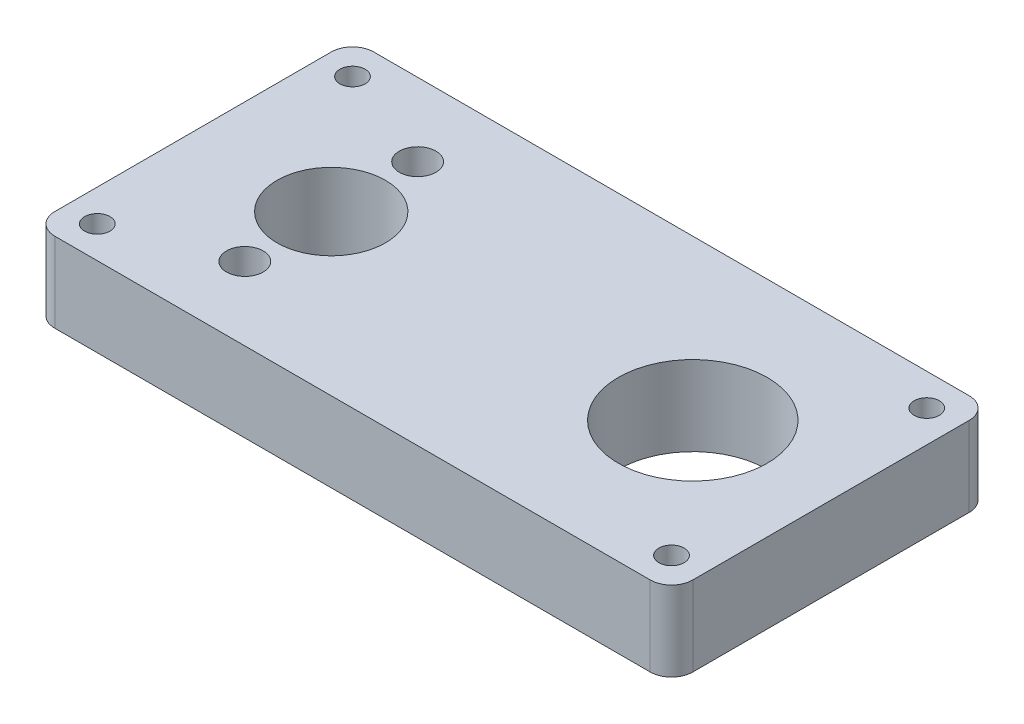
ISO-10303-21;
HEADER;
FILE_DESCRIPTION(('STEP AP214'),'2;1');
FILE_NAME('part.step','',(''),(''),'','','');
FILE_SCHEMA(('AUTOMOTIVE_DESIGN { 1 0 10303 214 1 1 1 1 }'));
ENDSEC;
DATA;
#1=APPLICATION_CONTEXT('core data for automotive mechanical design processes');
#2=APPLICATION_PROTOCOL_DEFINITION('international standard','automotive_design',2000,#1);
#3=PRODUCT_CONTEXT('',#1,'mechanical');
#4=PRODUCT('Part','Part','',(#3));
#5=PRODUCT_RELATED_PRODUCT_CATEGORY('part','',(#4));
#6=PRODUCT_DEFINITION_FORMATION('','',#4);
#7=PRODUCT_DEFINITION_CONTEXT('part definition',#1,'design');
#8=PRODUCT_DEFINITION('design','',#6,#7);
#9=PRODUCT_DEFINITION_SHAPE('','',#8);
#10=(LENGTH_UNIT() NAMED_UNIT(*) SI_UNIT(.MILLI.,.METRE.));
#11=(NAMED_UNIT(*) PLANE_ANGLE_UNIT() SI_UNIT($,.RADIAN.));
#12=(NAMED_UNIT(*) SI_UNIT($,.STERADIAN.) SOLID_ANGLE_UNIT());
#13=UNCERTAINTY_MEASURE_WITH_UNIT(LENGTH_MEASURE(1.E-05),#10,'distance_accuracy_value','');
#14=(GEOMETRIC_REPRESENTATION_CONTEXT(3) GLOBAL_UNCERTAINTY_ASSIGNED_CONTEXT((#13)) GLOBAL_UNIT_ASSIGNED_CONTEXT((#10,
#11,#12)) REPRESENTATION_CONTEXT('',''));
#15=CARTESIAN_POINT('',(0.,0.,0.));
#16=DIRECTION('',(0.,0.,1.));
#17=DIRECTION('',(1.,0.,0.));
#18=AXIS2_PLACEMENT_3D('',#15,#16,#17);
#19=CARTESIAN_POINT('',(-35.56,9.525,-16.51));
#20=DIRECTION('',(0.,-1.,0.));
#21=DIRECTION('',(0.,0.,-1.));
#22=AXIS2_PLACEMENT_3D('',#19,#20,#21);
#23=CYLINDRICAL_SURFACE('',#22,2.54);
#24=CARTESIAN_POINT('',(-35.56,0.,-16.51));
#25=DIRECTION('',(0.,-1.,0.));
#26=DIRECTION('',(0.,0.,-1.));
#27=AXIS2_PLACEMENT_3D('',#24,#25,#26);
#28=CIRCLE('',#27,2.54);
#29=CARTESIAN_POINT('',(-38.1,0.,-16.51));
#30=VERTEX_POINT('',#29);
#31=CARTESIAN_POINT('',(-35.56,0.,-19.05));
#32=VERTEX_POINT('',#31);
#33=EDGE_CURVE('E135',#30,#32,#28,.T.);
#34=ORIENTED_EDGE('',*,*,#33,.F.);
#35=DIRECTION('',(0.,-1.,0.));
#36=VECTOR('',#35,1.);
#37=CARTESIAN_POINT('',(-38.1,9.525,-16.51));
#38=LINE('',#37,#36);
#39=CARTESIAN_POINT('',(-38.1,9.525,-16.51));
#40=VERTEX_POINT('',#39);
#41=EDGE_CURVE('E11',#40,#30,#38,.T.);
#42=ORIENTED_EDGE('',*,*,#41,.F.);
#43=CARTESIAN_POINT('',(-35.56,9.525,-16.51));
#44=DIRECTION('',(0.,-1.,0.));
#45=DIRECTION('',(0.,0.,-1.));
#46=AXIS2_PLACEMENT_3D('',#43,#44,#45);
#47=CIRCLE('',#46,2.54);
#48=CARTESIAN_POINT('',(-35.56,9.525,-19.05));
#49=VERTEX_POINT('',#48);
#50=EDGE_CURVE('E156',#40,#49,#47,.T.);
#51=ORIENTED_EDGE('',*,*,#50,.T.);
#52=DIRECTION('',(0.,-1.,0.));
#53=VECTOR('',#52,1.);
#54=CARTESIAN_POINT('',(-35.56,9.525,-19.05));
#55=LINE('',#54,#53);
#56=EDGE_CURVE('E41',#49,#32,#55,.T.);
#57=ORIENTED_EDGE('',*,*,#56,.T.);
#58=EDGE_LOOP('',(#34,#42,#51,#57));
#59=FACE_BOUND('',#58,.T.);
#60=ADVANCED_FACE('F38',(#59),#23,.T.);
#61=CARTESIAN_POINT('',(-38.1,9.525,16.51));
#62=DIRECTION('',(-1.,0.,0.));
#63=DIRECTION('',(0.,0.,1.));
#64=AXIS2_PLACEMENT_3D('',#61,#62,#63);
#65=PLANE('',#64);
#66=DIRECTION('',(0.,0.,-1.));
#67=VECTOR('',#66,1.);
#68=CARTESIAN_POINT('',(-38.1,0.,16.51));
#69=LINE('',#68,#67);
#70=CARTESIAN_POINT('',(-38.1,0.,16.51));
#71=VERTEX_POINT('',#70);
#72=EDGE_CURVE('E154',#71,#30,#69,.T.);
#73=ORIENTED_EDGE('',*,*,#72,.F.);
#74=DIRECTION('',(0.,-1.,0.));
#75=VECTOR('',#74,1.);
#76=CARTESIAN_POINT('',(-38.1,9.525,16.51));
#77=LINE('',#76,#75);
#78=CARTESIAN_POINT('',(-38.1,9.525,16.51));
#79=VERTEX_POINT('',#78);
#80=EDGE_CURVE('E47',#79,#71,#77,.T.);
#81=ORIENTED_EDGE('',*,*,#80,.F.);
#82=DIRECTION('',(0.,0.,-1.));
#83=VECTOR('',#82,1.);
#84=CARTESIAN_POINT('',(-38.1,9.525,16.51));
#85=LINE('',#84,#83);
#86=EDGE_CURVE('E125',#79,#40,#85,.T.);
#87=ORIENTED_EDGE('',*,*,#86,.T.);
#88=ORIENTED_EDGE('',*,*,#41,.T.);
#89=EDGE_LOOP('',(#73,#81,#87,#88));
#90=FACE_BOUND('',#89,.T.);
#91=ADVANCED_FACE('F168',(#90),#65,.T.);
#92=CARTESIAN_POINT('',(-35.56,9.525,16.51));
#93=DIRECTION('',(0.,-1.,0.));
#94=DIRECTION('',(0.,0.,-1.));
#95=AXIS2_PLACEMENT_3D('',#92,#93,#94);
#96=CYLINDRICAL_SURFACE('',#95,2.54);
#97=CARTESIAN_POINT('',(-35.56,0.,16.51));
#98=DIRECTION('',(0.,-1.,0.));
#99=DIRECTION('',(0.,0.,-1.));
#100=AXIS2_PLACEMENT_3D('',#97,#98,#99);
#101=CIRCLE('',#100,2.54);
#102=CARTESIAN_POINT('',(-35.56,0.,19.05));
#103=VERTEX_POINT('',#102);
#104=EDGE_CURVE('E112',#103,#71,#101,.T.);
#105=ORIENTED_EDGE('',*,*,#104,.F.);
#106=DIRECTION('',(0.,-1.,0.));
#107=VECTOR('',#106,1.);
#108=CARTESIAN_POINT('',(-35.56,9.525,19.05));
#109=LINE('',#108,#107);
#110=CARTESIAN_POINT('',(-35.56,9.525,19.05));
#111=VERTEX_POINT('',#110);
#112=EDGE_CURVE('E107',#111,#103,#109,.T.);
#113=ORIENTED_EDGE('',*,*,#112,.F.);
#114=CARTESIAN_POINT('',(-35.56,9.525,16.51));
#115=DIRECTION('',(0.,-1.,0.));
#116=DIRECTION('',(0.,0.,-1.));
#117=AXIS2_PLACEMENT_3D('',#114,#115,#116);
#118=CIRCLE('',#117,2.54);
#119=EDGE_CURVE('E110',#111,#79,#118,.T.);
#120=ORIENTED_EDGE('',*,*,#119,.T.);
#121=ORIENTED_EDGE('',*,*,#80,.T.);
#122=EDGE_LOOP('',(#105,#113,#120,#121));
#123=FACE_BOUND('',#122,.T.);
#124=ADVANCED_FACE('F109',(#123),#96,.T.);
#125=CARTESIAN_POINT('',(35.56,9.525,19.05));
#126=DIRECTION('',(0.,0.,1.));
#127=DIRECTION('',(1.,0.,0.));
#128=AXIS2_PLACEMENT_3D('',#125,#126,#127);
#129=PLANE('',#128);
#130=DIRECTION('',(-1.,0.,0.));
#131=VECTOR('',#130,1.);
#132=CARTESIAN_POINT('',(35.56,0.,19.05));
#133=LINE('',#132,#131);
#134=CARTESIAN_POINT('',(35.56,0.,19.05));
#135=VERTEX_POINT('',#134);
#136=EDGE_CURVE('E151',#135,#103,#133,.T.);
#137=ORIENTED_EDGE('',*,*,#136,.F.);
#138=DIRECTION('',(0.,-1.,0.));
#139=VECTOR('',#138,1.);
#140=CARTESIAN_POINT('',(35.56,9.525,19.05));
#141=LINE('',#140,#139);
#142=CARTESIAN_POINT('',(35.56,9.525,19.05));
#143=VERTEX_POINT('',#142);
#144=EDGE_CURVE('E117',#143,#135,#141,.T.);
#145=ORIENTED_EDGE('',*,*,#144,.F.);
#146=DIRECTION('',(-1.,0.,0.));
#147=VECTOR('',#146,1.);
#148=CARTESIAN_POINT('',(35.56,9.525,19.05));
#149=LINE('',#148,#147);
#150=EDGE_CURVE('E123',#143,#111,#149,.T.);
#151=ORIENTED_EDGE('',*,*,#150,.T.);
#152=ORIENTED_EDGE('',*,*,#112,.T.);
#153=EDGE_LOOP('',(#137,#145,#151,#152));
#154=FACE_BOUND('',#153,.T.);
#155=ADVANCED_FACE('F127',(#154),#129,.T.);
#156=CARTESIAN_POINT('',(35.56,9.525,16.51));
#157=DIRECTION('',(0.,-1.,0.));
#158=DIRECTION('',(0.,0.,-1.));
#159=AXIS2_PLACEMENT_3D('',#156,#157,#158);
#160=CYLINDRICAL_SURFACE('',#159,2.54);
#161=CARTESIAN_POINT('',(35.56,0.,16.51));
#162=DIRECTION('',(0.,-1.,0.));
#163=DIRECTION('',(0.,0.,-1.));
#164=AXIS2_PLACEMENT_3D('',#161,#162,#163);
#165=CIRCLE('',#164,2.54);
#166=CARTESIAN_POINT('',(38.1,0.,16.51));
#167=VERTEX_POINT('',#166);
#168=EDGE_CURVE('E148',#167,#135,#165,.T.);
#169=ORIENTED_EDGE('',*,*,#168,.F.);
#170=DIRECTION('',(0.,-1.,0.));
#171=VECTOR('',#170,1.);
#172=CARTESIAN_POINT('',(38.1,9.525,16.51));
#173=LINE('',#172,#171);
#174=CARTESIAN_POINT('',(38.1,9.525,16.51));
#175=VERTEX_POINT('',#174);
#176=EDGE_CURVE('E160',#175,#167,#173,.T.);
#177=ORIENTED_EDGE('',*,*,#176,.F.);
#178=CARTESIAN_POINT('',(35.56,9.525,16.51));
#179=DIRECTION('',(0.,-1.,0.));
#180=DIRECTION('',(0.,0.,-1.));
#181=AXIS2_PLACEMENT_3D('',#178,#179,#180);
#182=CIRCLE('',#181,2.54);
#183=EDGE_CURVE('E128',#175,#143,#182,.T.);
#184=ORIENTED_EDGE('',*,*,#183,.T.);
#185=ORIENTED_EDGE('',*,*,#144,.T.);
#186=EDGE_LOOP('',(#169,#177,#184,#185));
#187=FACE_BOUND('',#186,.T.);
#188=ADVANCED_FACE('F181',(#187),#160,.T.);
#189=CARTESIAN_POINT('',(38.1,9.525,-16.51));
#190=DIRECTION('',(1.,0.,0.));
#191=DIRECTION('',(0.,0.,-1.));
#192=AXIS2_PLACEMENT_3D('',#189,#190,#191);
#193=PLANE('',#192);
#194=DIRECTION('',(0.,0.,1.));
#195=VECTOR('',#194,1.);
#196=CARTESIAN_POINT('',(38.1,0.,-16.51));
#197=LINE('',#196,#195);
#198=CARTESIAN_POINT('',(38.1,0.,-16.51));
#199=VERTEX_POINT('',#198);
#200=EDGE_CURVE('E145',#199,#167,#197,.T.);
#201=ORIENTED_EDGE('',*,*,#200,.F.);
#202=DIRECTION('',(0.,-1.,0.));
#203=VECTOR('',#202,1.);
#204=CARTESIAN_POINT('',(38.1,9.525,-16.51));
#205=LINE('',#204,#203);
#206=CARTESIAN_POINT('',(38.1,9.525,-16.51));
#207=VERTEX_POINT('',#206);
#208=EDGE_CURVE('E162',#207,#199,#205,.T.);
#209=ORIENTED_EDGE('',*,*,#208,.F.);
#210=DIRECTION('',(0.,0.,1.));
#211=VECTOR('',#210,1.);
#212=CARTESIAN_POINT('',(38.1,9.525,-16.51));
#213=LINE('',#212,#211);
#214=EDGE_CURVE('E130',#207,#175,#213,.T.);
#215=ORIENTED_EDGE('',*,*,#214,.T.);
#216=ORIENTED_EDGE('',*,*,#176,.T.);
#217=EDGE_LOOP('',(#201,#209,#215,#216));
#218=FACE_BOUND('',#217,.T.);
#219=ADVANCED_FACE('F184',(#218),#193,.T.);
#220=CARTESIAN_POINT('',(35.56,9.525,-16.51));
#221=DIRECTION('',(0.,-1.,0.));
#222=DIRECTION('',(0.,0.,-1.));
#223=AXIS2_PLACEMENT_3D('',#220,#221,#222);
#224=CYLINDRICAL_SURFACE('',#223,2.54);
#225=CARTESIAN_POINT('',(35.56,0.,-16.51));
#226=DIRECTION('',(0.,-1.,0.));
#227=DIRECTION('',(0.,0.,-1.));
#228=AXIS2_PLACEMENT_3D('',#225,#226,#227);
#229=CIRCLE('',#228,2.54);
#230=CARTESIAN_POINT('',(35.56,0.,-19.05));
#231=VERTEX_POINT('',#230);
#232=EDGE_CURVE('E142',#231,#199,#229,.T.);
#233=ORIENTED_EDGE('',*,*,#232,.F.);
#234=DIRECTION('',(0.,-1.,0.));
#235=VECTOR('',#234,1.);
#236=CARTESIAN_POINT('',(35.56,9.525,-19.05));
#237=LINE('',#236,#235);
#238=CARTESIAN_POINT('',(35.56,9.525,-19.05));
#239=VERTEX_POINT('',#238);
#240=EDGE_CURVE('E163',#239,#231,#237,.T.);
#241=ORIENTED_EDGE('',*,*,#240,.F.);
#242=CARTESIAN_POINT('',(35.56,9.525,-16.51));
#243=DIRECTION('',(0.,-1.,0.));
#244=DIRECTION('',(0.,0.,-1.));
#245=AXIS2_PLACEMENT_3D('',#242,#243,#244);
#246=CIRCLE('',#245,2.54);
#247=EDGE_CURVE('E290',#239,#207,#246,.T.);
#248=ORIENTED_EDGE('',*,*,#247,.T.);
#249=ORIENTED_EDGE('',*,*,#208,.T.);
#250=EDGE_LOOP('',(#233,#241,#248,#249));
#251=FACE_BOUND('',#250,.T.);
#252=ADVANCED_FACE('F188',(#251),#224,.T.);
#253=CARTESIAN_POINT('',(-35.56,9.525,-19.05));
#254=DIRECTION('',(0.,0.,-1.));
#255=DIRECTION('',(-1.,0.,0.));
#256=AXIS2_PLACEMENT_3D('',#253,#254,#255);
#257=PLANE('',#256);
#258=DIRECTION('',(1.,0.,0.));
#259=VECTOR('',#258,1.);
#260=CARTESIAN_POINT('',(-35.56,0.,-19.05));
#261=LINE('',#260,#259);
#262=EDGE_CURVE('E138',#32,#231,#261,.T.);
#263=ORIENTED_EDGE('',*,*,#262,.F.);
#264=ORIENTED_EDGE('',*,*,#56,.F.);
#265=DIRECTION('',(1.,0.,0.));
#266=VECTOR('',#265,1.);
#267=CARTESIAN_POINT('',(-35.56,9.525,-19.05));
#268=LINE('',#267,#266);
#269=EDGE_CURVE('E288',#49,#239,#268,.T.);
#270=ORIENTED_EDGE('',*,*,#269,.T.);
#271=ORIENTED_EDGE('',*,*,#240,.T.);
#272=EDGE_LOOP('',(#263,#264,#270,#271));
#273=FACE_BOUND('',#272,.T.);
#274=ADVANCED_FACE('F165',(#273),#257,.T.);
#275=CARTESIAN_POINT('',(-35.56,9.525,-16.51));
#276=DIRECTION('',(0.,-1.,0.));
#277=DIRECTION('',(0.,0.,-1.));
#278=AXIS2_PLACEMENT_3D('',#275,#276,#277);
#279=PLANE('',#278);
#280=CARTESIAN_POINT('',(-34.29,9.525,-15.24));
#281=DIRECTION('',(0.,1.,0.));
#282=DIRECTION('',(0.,0.,1.));
#283=AXIS2_PLACEMENT_3D('',#280,#281,#282);
#284=CIRCLE('',#283,1.5113);
#285=CARTESIAN_POINT('',(-34.29,9.525,-13.7287));
#286=VERTEX_POINT('',#285);
#287=EDGE_CURVE('E242',#286,#286,#284,.T.);
#288=ORIENTED_EDGE('',*,*,#287,.F.);
#289=EDGE_LOOP('',(#288));
#290=FACE_BOUND('',#289,.T.);
#291=CARTESIAN_POINT('',(-34.29,9.525,15.24));
#292=DIRECTION('',(0.,1.,0.));
#293=DIRECTION('',(0.,0.,1.));
#294=AXIS2_PLACEMENT_3D('',#291,#292,#293);
#295=CIRCLE('',#294,1.5113);
#296=CARTESIAN_POINT('',(-34.29,9.525,16.7513));
#297=VERTEX_POINT('',#296);
#298=EDGE_CURVE('E244',#297,#297,#295,.T.);
#299=ORIENTED_EDGE('',*,*,#298,.F.);
#300=EDGE_LOOP('',(#299));
#301=FACE_BOUND('',#300,.T.);
#302=CARTESIAN_POINT('',(34.29,9.525,15.24));
#303=DIRECTION('',(0.,1.,0.));
#304=DIRECTION('',(0.,0.,1.));
#305=AXIS2_PLACEMENT_3D('',#302,#303,#304);
#306=CIRCLE('',#305,1.5113);
#307=CARTESIAN_POINT('',(34.29,9.525,16.7513));
#308=VERTEX_POINT('',#307);
#309=EDGE_CURVE('E252',#308,#308,#306,.T.);
#310=ORIENTED_EDGE('',*,*,#309,.F.);
#311=EDGE_LOOP('',(#310));
#312=FACE_BOUND('',#311,.T.);
#313=CARTESIAN_POINT('',(34.29,9.525,-15.24));
#314=DIRECTION('',(0.,1.,0.));
#315=DIRECTION('',(0.,0.,1.));
#316=AXIS2_PLACEMENT_3D('',#313,#314,#315);
#317=CIRCLE('',#316,1.5113);
#318=CARTESIAN_POINT('',(34.29,9.525,-13.7287));
#319=VERTEX_POINT('',#318);
#320=EDGE_CURVE('E258',#319,#319,#317,.T.);
#321=ORIENTED_EDGE('',*,*,#320,.F.);
#322=EDGE_LOOP('',(#321));
#323=FACE_BOUND('',#322,.T.);
#324=CARTESIAN_POINT('',(21.59,9.525,0.));
#325=DIRECTION('',(0.,-1.,0.));
#326=DIRECTION('',(0.,0.,1.));
#327=AXIS2_PLACEMENT_3D('',#324,#325,#326);
#328=CIRCLE('',#327,8.89);
#329=CARTESIAN_POINT('',(21.59,9.525,-8.89));
#330=VERTEX_POINT('',#329);
#331=EDGE_CURVE('E265',#330,#330,#328,.T.);
#332=ORIENTED_EDGE('',*,*,#331,.T.);
#333=EDGE_LOOP('',(#332));
#334=FACE_BOUND('',#333,.T.);
#335=CARTESIAN_POINT('',(-21.59,9.525,10.31875));
#336=DIRECTION('',(0.,-1.,0.));
#337=DIRECTION('',(0.,0.,-1.));
#338=AXIS2_PLACEMENT_3D('',#335,#336,#337);
#339=CIRCLE('',#338,2.19075000000001);
#340=CARTESIAN_POINT('',(-21.59,9.525,8.12799999999999));
#341=VERTEX_POINT('',#340);
#342=EDGE_CURVE('E271',#341,#341,#339,.T.);
#343=ORIENTED_EDGE('',*,*,#342,.T.);
#344=EDGE_LOOP('',(#343));
#345=FACE_BOUND('',#344,.T.);
#346=CARTESIAN_POINT('',(-21.59,9.525,-10.31875));
#347=DIRECTION('',(0.,-1.,0.));
#348=DIRECTION('',(0.,0.,-1.));
#349=AXIS2_PLACEMENT_3D('',#346,#347,#348);
#350=CIRCLE('',#349,2.19075000000001);
#351=CARTESIAN_POINT('',(-21.59,9.525,-12.5095));
#352=VERTEX_POINT('',#351);
#353=EDGE_CURVE('E277',#352,#352,#350,.T.);
#354=ORIENTED_EDGE('',*,*,#353,.T.);
#355=EDGE_LOOP('',(#354));
#356=FACE_BOUND('',#355,.T.);
#357=CARTESIAN_POINT('',(-21.59,9.525,0.));
#358=DIRECTION('',(0.,-1.,0.));
#359=DIRECTION('',(0.,0.,-1.));
#360=AXIS2_PLACEMENT_3D('',#357,#358,#359);
#361=CIRCLE('',#360,6.477);
#362=CARTESIAN_POINT('',(-21.59,9.525,-6.477));
#363=VERTEX_POINT('',#362);
#364=EDGE_CURVE('E139',#363,#363,#361,.T.);
#365=ORIENTED_EDGE('',*,*,#364,.T.);
#366=EDGE_LOOP('',(#365));
#367=FACE_BOUND('',#366,.T.);
#368=ORIENTED_EDGE('',*,*,#50,.F.);
#369=ORIENTED_EDGE('',*,*,#86,.F.);
#370=ORIENTED_EDGE('',*,*,#119,.F.);
#371=ORIENTED_EDGE('',*,*,#150,.F.);
#372=ORIENTED_EDGE('',*,*,#183,.F.);
#373=ORIENTED_EDGE('',*,*,#214,.F.);
#374=ORIENTED_EDGE('',*,*,#247,.F.);
#375=ORIENTED_EDGE('',*,*,#269,.F.);
#376=EDGE_LOOP('',(#368,#369,#370,#371,#372,#373,#374,#375));
#377=FACE_BOUND('',#376,.T.);
#378=ADVANCED_FACE('F121',(#290,#301,#312,#323,#334,#345,#356,#367,#377),#279,.F.);
#379=CARTESIAN_POINT('',(-35.56,0.,-16.51));
#380=DIRECTION('',(0.,-1.,0.));
#381=DIRECTION('',(0.,0.,-1.));
#382=AXIS2_PLACEMENT_3D('',#379,#380,#381);
#383=PLANE('',#382);
#384=CARTESIAN_POINT('',(-34.29,0.,-15.24));
#385=DIRECTION('',(0.,-1.,0.));
#386=DIRECTION('',(0.,0.,-1.));
#387=AXIS2_PLACEMENT_3D('',#384,#385,#386);
#388=CIRCLE('',#387,1.5113);
#389=CARTESIAN_POINT('',(-34.29,0.,-16.7513));
#390=VERTEX_POINT('',#389);
#391=EDGE_CURVE('E240',#390,#390,#388,.T.);
#392=ORIENTED_EDGE('',*,*,#391,.F.);
#393=EDGE_LOOP('',(#392));
#394=FACE_BOUND('',#393,.T.);
#395=CARTESIAN_POINT('',(-34.29,0.,15.24));
#396=DIRECTION('',(0.,-1.,0.));
#397=DIRECTION('',(0.,0.,-1.));
#398=AXIS2_PLACEMENT_3D('',#395,#396,#397);
#399=CIRCLE('',#398,1.5113);
#400=CARTESIAN_POINT('',(-34.29,0.,13.7287));
#401=VERTEX_POINT('',#400);
#402=EDGE_CURVE('E249',#401,#401,#399,.T.);
#403=ORIENTED_EDGE('',*,*,#402,.F.);
#404=EDGE_LOOP('',(#403));
#405=FACE_BOUND('',#404,.T.);
#406=CARTESIAN_POINT('',(34.29,0.,15.24));
#407=DIRECTION('',(0.,-1.,0.));
#408=DIRECTION('',(0.,0.,-1.));
#409=AXIS2_PLACEMENT_3D('',#406,#407,#408);
#410=CIRCLE('',#409,1.5113);
#411=CARTESIAN_POINT('',(34.29,0.,13.7287));
#412=VERTEX_POINT('',#411);
#413=EDGE_CURVE('E255',#412,#412,#410,.T.);
#414=ORIENTED_EDGE('',*,*,#413,.F.);
#415=EDGE_LOOP('',(#414));
#416=FACE_BOUND('',#415,.T.);
#417=CARTESIAN_POINT('',(34.29,0.,-15.24));
#418=DIRECTION('',(0.,-1.,0.));
#419=DIRECTION('',(0.,0.,-1.));
#420=AXIS2_PLACEMENT_3D('',#417,#418,#419);
#421=CIRCLE('',#420,1.5113);
#422=CARTESIAN_POINT('',(34.29,0.,-16.7513));
#423=VERTEX_POINT('',#422);
#424=EDGE_CURVE('E261',#423,#423,#421,.T.);
#425=ORIENTED_EDGE('',*,*,#424,.F.);
#426=EDGE_LOOP('',(#425));
#427=FACE_BOUND('',#426,.T.);
#428=CARTESIAN_POINT('',(21.59,0.,0.));
#429=DIRECTION('',(0.,-1.,0.));
#430=DIRECTION('',(0.,0.,1.));
#431=AXIS2_PLACEMENT_3D('',#428,#429,#430);
#432=CIRCLE('',#431,8.89);
#433=CARTESIAN_POINT('',(21.59,0.,-8.89));
#434=VERTEX_POINT('',#433);
#435=EDGE_CURVE('E264',#434,#434,#432,.T.);
#436=ORIENTED_EDGE('',*,*,#435,.F.);
#437=EDGE_LOOP('',(#436));
#438=FACE_BOUND('',#437,.T.);
#439=CARTESIAN_POINT('',(-21.59,0.,10.31875));
#440=DIRECTION('',(0.,-1.,0.));
#441=DIRECTION('',(0.,0.,-1.));
#442=AXIS2_PLACEMENT_3D('',#439,#440,#441);
#443=CIRCLE('',#442,2.19075000000001);
#444=CARTESIAN_POINT('',(-21.59,0.,8.12799999999999));
#445=VERTEX_POINT('',#444);
#446=EDGE_CURVE('E268',#445,#445,#443,.T.);
#447=ORIENTED_EDGE('',*,*,#446,.F.);
#448=EDGE_LOOP('',(#447));
#449=FACE_BOUND('',#448,.T.);
#450=CARTESIAN_POINT('',(-21.59,0.,-10.31875));
#451=DIRECTION('',(0.,-1.,0.));
#452=DIRECTION('',(0.,0.,-1.));
#453=AXIS2_PLACEMENT_3D('',#450,#451,#452);
#454=CIRCLE('',#453,2.19075000000001);
#455=CARTESIAN_POINT('',(-21.59,0.,-12.5095));
#456=VERTEX_POINT('',#455);
#457=EDGE_CURVE('E274',#456,#456,#454,.T.);
#458=ORIENTED_EDGE('',*,*,#457,.F.);
#459=EDGE_LOOP('',(#458));
#460=FACE_BOUND('',#459,.T.);
#461=CARTESIAN_POINT('',(-21.59,0.,0.));
#462=DIRECTION('',(0.,-1.,0.));
#463=DIRECTION('',(0.,0.,-1.));
#464=AXIS2_PLACEMENT_3D('',#461,#462,#463);
#465=CIRCLE('',#464,6.477);
#466=CARTESIAN_POINT('',(-21.59,0.,-6.477));
#467=VERTEX_POINT('',#466);
#468=EDGE_CURVE('E280',#467,#467,#465,.T.);
#469=ORIENTED_EDGE('',*,*,#468,.F.);
#470=EDGE_LOOP('',(#469));
#471=FACE_BOUND('',#470,.T.);
#472=ORIENTED_EDGE('',*,*,#33,.T.);
#473=ORIENTED_EDGE('',*,*,#262,.T.);
#474=ORIENTED_EDGE('',*,*,#232,.T.);
#475=ORIENTED_EDGE('',*,*,#200,.T.);
#476=ORIENTED_EDGE('',*,*,#168,.T.);
#477=ORIENTED_EDGE('',*,*,#136,.T.);
#478=ORIENTED_EDGE('',*,*,#104,.T.);
#479=ORIENTED_EDGE('',*,*,#72,.T.);
#480=EDGE_LOOP('',(#472,#473,#474,#475,#476,#477,#478,#479));
#481=FACE_BOUND('',#480,.T.);
#482=ADVANCED_FACE('F167',(#394,#405,#416,#427,#438,#449,#460,#471,#481),#383,.T.);
#483=CARTESIAN_POINT('',(-21.59,9.525,0.));
#484=DIRECTION('',(0.,-1.,0.));
#485=DIRECTION('',(0.,0.,-1.));
#486=AXIS2_PLACEMENT_3D('',#483,#484,#485);
#487=CYLINDRICAL_SURFACE('',#486,6.477);
#488=CARTESIAN_POINT('',(-21.59,9.525,-6.477));
#489=CARTESIAN_POINT('',(-21.59,9.42578125,-6.477));
#490=CARTESIAN_POINT('',(-21.59,9.3265625,-6.477));
#491=CARTESIAN_POINT('',(-21.59,9.128125,-6.477));
#492=CARTESIAN_POINT('',(-21.59,9.02890625,-6.477));
#493=CARTESIAN_POINT('',(-21.59,8.83046875,-6.477));
#494=CARTESIAN_POINT('',(-21.59,8.73125,-6.477));
#495=CARTESIAN_POINT('',(-21.59,8.5328125,-6.477));
#496=CARTESIAN_POINT('',(-21.59,8.43359375,-6.477));
#497=CARTESIAN_POINT('',(-21.59,8.23515625,-6.477));
#498=CARTESIAN_POINT('',(-21.59,8.1359375,-6.477));
#499=CARTESIAN_POINT('',(-21.59,7.9375,-6.477));
#500=CARTESIAN_POINT('',(-21.59,7.83828125,-6.477));
#501=CARTESIAN_POINT('',(-21.59,7.63984375,-6.477));
#502=CARTESIAN_POINT('',(-21.59,7.540625,-6.477));
#503=CARTESIAN_POINT('',(-21.59,7.3421875,-6.477));
#504=CARTESIAN_POINT('',(-21.59,7.24296875,-6.477));
#505=CARTESIAN_POINT('',(-21.59,7.04453125,-6.477));
#506=CARTESIAN_POINT('',(-21.59,6.9453125,-6.477));
#507=CARTESIAN_POINT('',(-21.59,6.746875,-6.477));
#508=CARTESIAN_POINT('',(-21.59,6.64765625,-6.477));
#509=CARTESIAN_POINT('',(-21.59,6.44921875,-6.477));
#510=CARTESIAN_POINT('',(-21.59,6.35,-6.477));
#511=CARTESIAN_POINT('',(-21.59,6.1515625,-6.477));
#512=CARTESIAN_POINT('',(-21.59,6.05234375,-6.477));
#513=CARTESIAN_POINT('',(-21.59,5.85390625,-6.477));
#514=CARTESIAN_POINT('',(-21.59,5.7546875,-6.477));
#515=CARTESIAN_POINT('',(-21.59,5.55625,-6.477));
#516=CARTESIAN_POINT('',(-21.59,5.45703125,-6.477));
#517=CARTESIAN_POINT('',(-21.59,5.25859375,-6.477));
#518=CARTESIAN_POINT('',(-21.59,5.159375,-6.477));
#519=CARTESIAN_POINT('',(-21.59,4.9609375,-6.477));
#520=CARTESIAN_POINT('',(-21.59,4.86171875,-6.477));
#521=CARTESIAN_POINT('',(-21.59,4.66328125,-6.477));
#522=CARTESIAN_POINT('',(-21.59,4.5640625,-6.477));
#523=CARTESIAN_POINT('',(-21.59,4.365625,-6.477));
#524=CARTESIAN_POINT('',(-21.59,4.26640625,-6.477));
#525=CARTESIAN_POINT('',(-21.59,4.06796875,-6.477));
#526=CARTESIAN_POINT('',(-21.59,3.96875,-6.477));
#527=CARTESIAN_POINT('',(-21.59,3.7703125,-6.477));
#528=CARTESIAN_POINT('',(-21.59,3.67109375,-6.477));
#529=CARTESIAN_POINT('',(-21.59,3.47265625,-6.477));
#530=CARTESIAN_POINT('',(-21.59,3.3734375,-6.477));
#531=CARTESIAN_POINT('',(-21.59,3.175,-6.477));
#532=CARTESIAN_POINT('',(-21.59,3.07578125,-6.477));
#533=CARTESIAN_POINT('',(-21.59,2.87734375,-6.477));
#534=CARTESIAN_POINT('',(-21.59,2.778125,-6.477));
#535=CARTESIAN_POINT('',(-21.59,2.5796875,-6.477));
#536=CARTESIAN_POINT('',(-21.59,2.48046875,-6.477));
#537=CARTESIAN_POINT('',(-21.59,2.28203125,-6.477));
#538=CARTESIAN_POINT('',(-21.59,2.1828125,-6.477));
#539=CARTESIAN_POINT('',(-21.59,1.984375,-6.477));
#540=CARTESIAN_POINT('',(-21.59,1.88515625,-6.477));
#541=CARTESIAN_POINT('',(-21.59,1.68671875,-6.477));
#542=CARTESIAN_POINT('',(-21.59,1.5875,-6.477));
#543=CARTESIAN_POINT('',(-21.59,1.3890625,-6.477));
#544=CARTESIAN_POINT('',(-21.59,1.28984375,-6.477));
#545=CARTESIAN_POINT('',(-21.59,1.09140625,-6.477));
#546=CARTESIAN_POINT('',(-21.59,0.992187500000001,-6.477));
#547=CARTESIAN_POINT('',(-21.59,0.793750000000001,-6.477));
#548=CARTESIAN_POINT('',(-21.59,0.69453125,-6.477));
#549=CARTESIAN_POINT('',(-21.59,0.49609375,-6.477));
#550=CARTESIAN_POINT('',(-21.59,0.396875,-6.477));
#551=CARTESIAN_POINT('',(-21.59,0.1984375,-6.477));
#552=CARTESIAN_POINT('',(-21.59,0.0992187500000001,-6.477));
#553=CARTESIAN_POINT('',(-21.59,0.,-6.477));
#554=B_SPLINE_CURVE_WITH_KNOTS('',3,(#488,#489,#490,#491,#492,#493,#494,#495,#496,#497,#498,
#499,#500,#501,#502,#503,#504,#505,#506,#507,#508,#509,#510,#511,#512,#513,#514,#515,#516,#517,
#518,#519,#520,#521,#522,#523,#524,#525,#526,#527,#528,#529,#530,#531,#532,#533,#534,#535,#536,
#537,#538,#539,#540,#541,#542,#543,#544,#545,#546,#547,#548,#549,#550,#551,#552,#553),
.UNSPECIFIED.,.F.,.F.,(4,2,2,2,2,2,2,2,2,2,2,2,2,2,2,2,2,2,2,2,2,2,2,2,2,2,2,2,2,2,2,2,4),(0.,
0.297656249999998,0.595312499999999,0.892968749999999,1.190625,1.48828125,1.7859375,2.08359375,
2.38125,2.67890625,2.9765625,3.27421875,3.571875,3.86953125,4.1671875,4.46484375,4.7625,
5.06015625,5.3578125,5.65546875,5.953125,6.25078125,6.5484375,6.84609375,7.14375,7.44140625,
7.7390625,8.03671875,8.334375,8.63203125,8.9296875,9.22734375,9.525),.UNSPECIFIED.);
#555=EDGE_CURVE('BSEAM200',#363,#467,#554,.T.);
#556=ORIENTED_EDGE('',*,*,#364,.F.);
#557=ORIENTED_EDGE('',*,*,#468,.T.);
#558=ORIENTED_EDGE('',*,*,#555,.T.);
#559=ORIENTED_EDGE('',*,*,#555,.F.);
#560=EDGE_LOOP('',(#556,#558,#557,#559));
#561=FACE_BOUND('',#560,.T.);
#562=ADVANCED_FACE('F200',(#561),#487,.F.);
#563=CARTESIAN_POINT('',(-21.59,9.525,-10.31875));
#564=DIRECTION('',(0.,-1.,0.));
#565=DIRECTION('',(0.,0.,-1.));
#566=AXIS2_PLACEMENT_3D('',#563,#564,#565);
#567=CYLINDRICAL_SURFACE('',#566,2.19075000000001);
#568=CARTESIAN_POINT('',(-21.59,9.525,-12.5095));
#569=CARTESIAN_POINT('',(-21.59,9.42578125,-12.5095));
#570=CARTESIAN_POINT('',(-21.59,9.3265625,-12.5095));
#571=CARTESIAN_POINT('',(-21.59,9.128125,-12.5095));
#572=CARTESIAN_POINT('',(-21.59,9.02890625,-12.5095));
#573=CARTESIAN_POINT('',(-21.59,8.83046875,-12.5095));
#574=CARTESIAN_POINT('',(-21.59,8.73125,-12.5095));
#575=CARTESIAN_POINT('',(-21.59,8.5328125,-12.5095));
#576=CARTESIAN_POINT('',(-21.59,8.43359375,-12.5095));
#577=CARTESIAN_POINT('',(-21.59,8.23515625,-12.5095));
#578=CARTESIAN_POINT('',(-21.59,8.1359375,-12.5095));
#579=CARTESIAN_POINT('',(-21.59,7.9375,-12.5095));
#580=CARTESIAN_POINT('',(-21.59,7.83828125,-12.5095));
#581=CARTESIAN_POINT('',(-21.59,7.63984375,-12.5095));
#582=CARTESIAN_POINT('',(-21.59,7.540625,-12.5095));
#583=CARTESIAN_POINT('',(-21.59,7.3421875,-12.5095));
#584=CARTESIAN_POINT('',(-21.59,7.24296875,-12.5095));
#585=CARTESIAN_POINT('',(-21.59,7.04453125,-12.5095));
#586=CARTESIAN_POINT('',(-21.59,6.9453125,-12.5095));
#587=CARTESIAN_POINT('',(-21.59,6.746875,-12.5095));
#588=CARTESIAN_POINT('',(-21.59,6.64765625,-12.5095));
#589=CARTESIAN_POINT('',(-21.59,6.44921875,-12.5095));
#590=CARTESIAN_POINT('',(-21.59,6.35,-12.5095));
#591=CARTESIAN_POINT('',(-21.59,6.1515625,-12.5095));
#592=CARTESIAN_POINT('',(-21.59,6.05234375,-12.5095));
#593=CARTESIAN_POINT('',(-21.59,5.85390625,-12.5095));
#594=CARTESIAN_POINT('',(-21.59,5.7546875,-12.5095));
#595=CARTESIAN_POINT('',(-21.59,5.55625,-12.5095));
#596=CARTESIAN_POINT('',(-21.59,5.45703125,-12.5095));
#597=CARTESIAN_POINT('',(-21.59,5.25859375,-12.5095));
#598=CARTESIAN_POINT('',(-21.59,5.159375,-12.5095));
#599=CARTESIAN_POINT('',(-21.59,4.9609375,-12.5095));
#600=CARTESIAN_POINT('',(-21.59,4.86171875,-12.5095));
#601=CARTESIAN_POINT('',(-21.59,4.66328125,-12.5095));
#602=CARTESIAN_POINT('',(-21.59,4.5640625,-12.5095));
#603=CARTESIAN_POINT('',(-21.59,4.365625,-12.5095));
#604=CARTESIAN_POINT('',(-21.59,4.26640625,-12.5095));
#605=CARTESIAN_POINT('',(-21.59,4.06796875,-12.5095));
#606=CARTESIAN_POINT('',(-21.59,3.96875,-12.5095));
#607=CARTESIAN_POINT('',(-21.59,3.7703125,-12.5095));
#608=CARTESIAN_POINT('',(-21.59,3.67109375,-12.5095));
#609=CARTESIAN_POINT('',(-21.59,3.47265625,-12.5095));
#610=CARTESIAN_POINT('',(-21.59,3.3734375,-12.5095));
#611=CARTESIAN_POINT('',(-21.59,3.175,-12.5095));
#612=CARTESIAN_POINT('',(-21.59,3.07578125,-12.5095));
#613=CARTESIAN_POINT('',(-21.59,2.87734375,-12.5095));
#614=CARTESIAN_POINT('',(-21.59,2.778125,-12.5095));
#615=CARTESIAN_POINT('',(-21.59,2.5796875,-12.5095));
#616=CARTESIAN_POINT('',(-21.59,2.48046875,-12.5095));
#617=CARTESIAN_POINT('',(-21.59,2.28203125,-12.5095));
#618=CARTESIAN_POINT('',(-21.59,2.1828125,-12.5095));
#619=CARTESIAN_POINT('',(-21.59,1.984375,-12.5095));
#620=CARTESIAN_POINT('',(-21.59,1.88515625,-12.5095));
#621=CARTESIAN_POINT('',(-21.59,1.68671875,-12.5095));
#622=CARTESIAN_POINT('',(-21.59,1.5875,-12.5095));
#623=CARTESIAN_POINT('',(-21.59,1.3890625,-12.5095));
#624=CARTESIAN_POINT('',(-21.59,1.28984375,-12.5095));
#625=CARTESIAN_POINT('',(-21.59,1.09140625,-12.5095));
#626=CARTESIAN_POINT('',(-21.59,0.992187500000001,-12.5095));
#627=CARTESIAN_POINT('',(-21.59,0.793750000000001,-12.5095));
#628=CARTESIAN_POINT('',(-21.59,0.69453125,-12.5095));
#629=CARTESIAN_POINT('',(-21.59,0.49609375,-12.5095));
#630=CARTESIAN_POINT('',(-21.59,0.396875,-12.5095));
#631=CARTESIAN_POINT('',(-21.59,0.1984375,-12.5095));
#632=CARTESIAN_POINT('',(-21.59,0.0992187500000001,-12.5095));
#633=CARTESIAN_POINT('',(-21.59,0.,-12.5095));
#634=B_SPLINE_CURVE_WITH_KNOTS('',3,(#568,#569,#570,#571,#572,#573,#574,#575,#576,#577,#578,
#579,#580,#581,#582,#583,#584,#585,#586,#587,#588,#589,#590,#591,#592,#593,#594,#595,#596,#597,
#598,#599,#600,#601,#602,#603,#604,#605,#606,#607,#608,#609,#610,#611,#612,#613,#614,#615,#616,
#617,#618,#619,#620,#621,#622,#623,#624,#625,#626,#627,#628,#629,#630,#631,#632,#633),
.UNSPECIFIED.,.F.,.F.,(4,2,2,2,2,2,2,2,2,2,2,2,2,2,2,2,2,2,2,2,2,2,2,2,2,2,2,2,2,2,2,2,4),(0.,
0.297656249999998,0.595312499999999,0.892968749999999,1.190625,1.48828125,1.7859375,2.08359375,
2.38125,2.67890625,2.9765625,3.27421875,3.571875,3.86953125,4.1671875,4.46484375,4.7625,
5.06015625,5.3578125,5.65546875,5.953125,6.25078125,6.5484375,6.84609375,7.14375,7.44140625,
7.7390625,8.03671875,8.334375,8.63203125,8.9296875,9.22734375,9.525),.UNSPECIFIED.);
#635=EDGE_CURVE('BSEAM207',#352,#456,#634,.T.);
#636=ORIENTED_EDGE('',*,*,#353,.F.);
#637=ORIENTED_EDGE('',*,*,#457,.T.);
#638=ORIENTED_EDGE('',*,*,#635,.T.);
#639=ORIENTED_EDGE('',*,*,#635,.F.);
#640=EDGE_LOOP('',(#636,#638,#637,#639));
#641=FACE_BOUND('',#640,.T.);
#642=ADVANCED_FACE('F207',(#641),#567,.F.);
#643=CARTESIAN_POINT('',(-21.59,9.525,10.31875));
#644=DIRECTION('',(0.,-1.,0.));
#645=DIRECTION('',(0.,0.,-1.));
#646=AXIS2_PLACEMENT_3D('',#643,#644,#645);
#647=CYLINDRICAL_SURFACE('',#646,2.19075000000001);
#648=CARTESIAN_POINT('',(-21.59,9.525,8.12799999999999));
#649=CARTESIAN_POINT('',(-21.59,9.42578125,8.12799999999999));
#650=CARTESIAN_POINT('',(-21.59,9.3265625,8.12799999999999));
#651=CARTESIAN_POINT('',(-21.59,9.128125,8.12799999999999));
#652=CARTESIAN_POINT('',(-21.59,9.02890625,8.12799999999999));
#653=CARTESIAN_POINT('',(-21.59,8.83046875,8.12799999999999));
#654=CARTESIAN_POINT('',(-21.59,8.73125,8.12799999999999));
#655=CARTESIAN_POINT('',(-21.59,8.5328125,8.12799999999999));
#656=CARTESIAN_POINT('',(-21.59,8.43359375,8.12799999999999));
#657=CARTESIAN_POINT('',(-21.59,8.23515625,8.12799999999999));
#658=CARTESIAN_POINT('',(-21.59,8.1359375,8.12799999999999));
#659=CARTESIAN_POINT('',(-21.59,7.9375,8.12799999999999));
#660=CARTESIAN_POINT('',(-21.59,7.83828125,8.12799999999999));
#661=CARTESIAN_POINT('',(-21.59,7.63984375,8.12799999999999));
#662=CARTESIAN_POINT('',(-21.59,7.540625,8.12799999999999));
#663=CARTESIAN_POINT('',(-21.59,7.3421875,8.12799999999999));
#664=CARTESIAN_POINT('',(-21.59,7.24296875,8.12799999999999));
#665=CARTESIAN_POINT('',(-21.59,7.04453125,8.12799999999999));
#666=CARTESIAN_POINT('',(-21.59,6.9453125,8.12799999999999));
#667=CARTESIAN_POINT('',(-21.59,6.746875,8.12799999999999));
#668=CARTESIAN_POINT('',(-21.59,6.64765625,8.12799999999999));
#669=CARTESIAN_POINT('',(-21.59,6.44921875,8.12799999999999));
#670=CARTESIAN_POINT('',(-21.59,6.35,8.12799999999999));
#671=CARTESIAN_POINT('',(-21.59,6.1515625,8.12799999999999));
#672=CARTESIAN_POINT('',(-21.59,6.05234375,8.12799999999999));
#673=CARTESIAN_POINT('',(-21.59,5.85390625,8.12799999999999));
#674=CARTESIAN_POINT('',(-21.59,5.7546875,8.12799999999999));
#675=CARTESIAN_POINT('',(-21.59,5.55625,8.12799999999999));
#676=CARTESIAN_POINT('',(-21.59,5.45703125,8.12799999999999));
#677=CARTESIAN_POINT('',(-21.59,5.25859375,8.12799999999999));
#678=CARTESIAN_POINT('',(-21.59,5.159375,8.12799999999999));
#679=CARTESIAN_POINT('',(-21.59,4.9609375,8.12799999999999));
#680=CARTESIAN_POINT('',(-21.59,4.86171875,8.12799999999999));
#681=CARTESIAN_POINT('',(-21.59,4.66328125,8.12799999999999));
#682=CARTESIAN_POINT('',(-21.59,4.5640625,8.12799999999999));
#683=CARTESIAN_POINT('',(-21.59,4.365625,8.12799999999999));
#684=CARTESIAN_POINT('',(-21.59,4.26640625,8.12799999999999));
#685=CARTESIAN_POINT('',(-21.59,4.06796875,8.12799999999999));
#686=CARTESIAN_POINT('',(-21.59,3.96875,8.12799999999999));
#687=CARTESIAN_POINT('',(-21.59,3.7703125,8.12799999999999));
#688=CARTESIAN_POINT('',(-21.59,3.67109375,8.12799999999999));
#689=CARTESIAN_POINT('',(-21.59,3.47265625,8.12799999999999));
#690=CARTESIAN_POINT('',(-21.59,3.3734375,8.12799999999999));
#691=CARTESIAN_POINT('',(-21.59,3.175,8.12799999999999));
#692=CARTESIAN_POINT('',(-21.59,3.07578125,8.12799999999999));
#693=CARTESIAN_POINT('',(-21.59,2.87734375,8.12799999999999));
#694=CARTESIAN_POINT('',(-21.59,2.778125,8.12799999999999));
#695=CARTESIAN_POINT('',(-21.59,2.5796875,8.12799999999999));
#696=CARTESIAN_POINT('',(-21.59,2.48046875,8.12799999999999));
#697=CARTESIAN_POINT('',(-21.59,2.28203125,8.12799999999999));
#698=CARTESIAN_POINT('',(-21.59,2.1828125,8.12799999999999));
#699=CARTESIAN_POINT('',(-21.59,1.984375,8.12799999999999));
#700=CARTESIAN_POINT('',(-21.59,1.88515625,8.12799999999999));
#701=CARTESIAN_POINT('',(-21.59,1.68671875,8.12799999999999));
#702=CARTESIAN_POINT('',(-21.59,1.5875,8.12799999999999));
#703=CARTESIAN_POINT('',(-21.59,1.3890625,8.12799999999999));
#704=CARTESIAN_POINT('',(-21.59,1.28984375,8.12799999999999));
#705=CARTESIAN_POINT('',(-21.59,1.09140625,8.12799999999999));
#706=CARTESIAN_POINT('',(-21.59,0.992187500000001,8.12799999999999));
#707=CARTESIAN_POINT('',(-21.59,0.793750000000001,8.12799999999999));
#708=CARTESIAN_POINT('',(-21.59,0.69453125,8.12799999999999));
#709=CARTESIAN_POINT('',(-21.59,0.49609375,8.12799999999999));
#710=CARTESIAN_POINT('',(-21.59,0.396875,8.12799999999999));
#711=CARTESIAN_POINT('',(-21.59,0.1984375,8.12799999999999));
#712=CARTESIAN_POINT('',(-21.59,0.0992187500000001,8.12799999999999));
#713=CARTESIAN_POINT('',(-21.59,0.,8.12799999999999));
#714=B_SPLINE_CURVE_WITH_KNOTS('',3,(#648,#649,#650,#651,#652,#653,#654,#655,#656,#657,#658,
#659,#660,#661,#662,#663,#664,#665,#666,#667,#668,#669,#670,#671,#672,#673,#674,#675,#676,#677,
#678,#679,#680,#681,#682,#683,#684,#685,#686,#687,#688,#689,#690,#691,#692,#693,#694,#695,#696,
#697,#698,#699,#700,#701,#702,#703,#704,#705,#706,#707,#708,#709,#710,#711,#712,#713),
.UNSPECIFIED.,.F.,.F.,(4,2,2,2,2,2,2,2,2,2,2,2,2,2,2,2,2,2,2,2,2,2,2,2,2,2,2,2,2,2,2,2,4),(0.,
0.297656249999998,0.595312499999999,0.892968749999999,1.190625,1.48828125,1.7859375,2.08359375,
2.38125,2.67890625,2.9765625,3.27421875,3.571875,3.86953125,4.1671875,4.46484375,4.7625,
5.06015625,5.3578125,5.65546875,5.953125,6.25078125,6.5484375,6.84609375,7.14375,7.44140625,
7.7390625,8.03671875,8.334375,8.63203125,8.9296875,9.22734375,9.525),.UNSPECIFIED.);
#715=EDGE_CURVE('BSEAM211',#341,#445,#714,.T.);
#716=ORIENTED_EDGE('',*,*,#342,.F.);
#717=ORIENTED_EDGE('',*,*,#446,.T.);
#718=ORIENTED_EDGE('',*,*,#715,.T.);
#719=ORIENTED_EDGE('',*,*,#715,.F.);
#720=EDGE_LOOP('',(#716,#718,#717,#719));
#721=FACE_BOUND('',#720,.T.);
#722=ADVANCED_FACE('F211',(#721),#647,.F.);
#723=CARTESIAN_POINT('',(21.59,9.525,0.));
#724=DIRECTION('',(0.,-1.,0.));
#725=DIRECTION('',(0.,0.,-1.));
#726=AXIS2_PLACEMENT_3D('',#723,#724,#725);
#727=CYLINDRICAL_SURFACE('',#726,8.89);
#728=CARTESIAN_POINT('',(21.59,9.525,-8.89));
#729=CARTESIAN_POINT('',(21.59,9.42578125,-8.89));
#730=CARTESIAN_POINT('',(21.59,9.3265625,-8.89));
#731=CARTESIAN_POINT('',(21.59,9.128125,-8.89));
#732=CARTESIAN_POINT('',(21.59,9.02890625,-8.89));
#733=CARTESIAN_POINT('',(21.59,8.83046875,-8.89));
#734=CARTESIAN_POINT('',(21.59,8.73125,-8.89));
#735=CARTESIAN_POINT('',(21.59,8.5328125,-8.89));
#736=CARTESIAN_POINT('',(21.59,8.43359375,-8.89));
#737=CARTESIAN_POINT('',(21.59,8.23515625,-8.89));
#738=CARTESIAN_POINT('',(21.59,8.1359375,-8.89));
#739=CARTESIAN_POINT('',(21.59,7.9375,-8.89));
#740=CARTESIAN_POINT('',(21.59,7.83828125,-8.89));
#741=CARTESIAN_POINT('',(21.59,7.63984375,-8.89));
#742=CARTESIAN_POINT('',(21.59,7.540625,-8.89));
#743=CARTESIAN_POINT('',(21.59,7.3421875,-8.89));
#744=CARTESIAN_POINT('',(21.59,7.24296875,-8.89));
#745=CARTESIAN_POINT('',(21.59,7.04453125,-8.89));
#746=CARTESIAN_POINT('',(21.59,6.9453125,-8.89));
#747=CARTESIAN_POINT('',(21.59,6.746875,-8.89));
#748=CARTESIAN_POINT('',(21.59,6.64765625,-8.89));
#749=CARTESIAN_POINT('',(21.59,6.44921875,-8.89));
#750=CARTESIAN_POINT('',(21.59,6.35,-8.89));
#751=CARTESIAN_POINT('',(21.59,6.1515625,-8.89));
#752=CARTESIAN_POINT('',(21.59,6.05234375,-8.89));
#753=CARTESIAN_POINT('',(21.59,5.85390625,-8.89));
#754=CARTESIAN_POINT('',(21.59,5.7546875,-8.89));
#755=CARTESIAN_POINT('',(21.59,5.55625,-8.89));
#756=CARTESIAN_POINT('',(21.59,5.45703125,-8.89));
#757=CARTESIAN_POINT('',(21.59,5.25859375,-8.89));
#758=CARTESIAN_POINT('',(21.59,5.159375,-8.89));
#759=CARTESIAN_POINT('',(21.59,4.9609375,-8.89));
#760=CARTESIAN_POINT('',(21.59,4.86171875,-8.89));
#761=CARTESIAN_POINT('',(21.59,4.66328125,-8.89));
#762=CARTESIAN_POINT('',(21.59,4.5640625,-8.89));
#763=CARTESIAN_POINT('',(21.59,4.365625,-8.89));
#764=CARTESIAN_POINT('',(21.59,4.26640625,-8.89));
#765=CARTESIAN_POINT('',(21.59,4.06796875,-8.89));
#766=CARTESIAN_POINT('',(21.59,3.96875,-8.89));
#767=CARTESIAN_POINT('',(21.59,3.7703125,-8.89));
#768=CARTESIAN_POINT('',(21.59,3.67109375,-8.89));
#769=CARTESIAN_POINT('',(21.59,3.47265625,-8.89));
#770=CARTESIAN_POINT('',(21.59,3.3734375,-8.89));
#771=CARTESIAN_POINT('',(21.59,3.175,-8.89));
#772=CARTESIAN_POINT('',(21.59,3.07578125,-8.89));
#773=CARTESIAN_POINT('',(21.59,2.87734375,-8.89));
#774=CARTESIAN_POINT('',(21.59,2.778125,-8.89));
#775=CARTESIAN_POINT('',(21.59,2.5796875,-8.89));
#776=CARTESIAN_POINT('',(21.59,2.48046875,-8.89));
#777=CARTESIAN_POINT('',(21.59,2.28203125,-8.89));
#778=CARTESIAN_POINT('',(21.59,2.1828125,-8.89));
#779=CARTESIAN_POINT('',(21.59,1.984375,-8.89));
#780=CARTESIAN_POINT('',(21.59,1.88515625,-8.89));
#781=CARTESIAN_POINT('',(21.59,1.68671875,-8.89));
#782=CARTESIAN_POINT('',(21.59,1.5875,-8.89));
#783=CARTESIAN_POINT('',(21.59,1.3890625,-8.89));
#784=CARTESIAN_POINT('',(21.59,1.28984375,-8.89));
#785=CARTESIAN_POINT('',(21.59,1.09140625,-8.89));
#786=CARTESIAN_POINT('',(21.59,0.992187500000001,-8.89));
#787=CARTESIAN_POINT('',(21.59,0.793750000000001,-8.89));
#788=CARTESIAN_POINT('',(21.59,0.69453125,-8.89));
#789=CARTESIAN_POINT('',(21.59,0.49609375,-8.89));
#790=CARTESIAN_POINT('',(21.59,0.396875,-8.89));
#791=CARTESIAN_POINT('',(21.59,0.1984375,-8.89));
#792=CARTESIAN_POINT('',(21.59,0.0992187500000001,-8.89));
#793=CARTESIAN_POINT('',(21.59,0.,-8.89));
#794=B_SPLINE_CURVE_WITH_KNOTS('',3,(#728,#729,#730,#731,#732,#733,#734,#735,#736,#737,#738,
#739,#740,#741,#742,#743,#744,#745,#746,#747,#748,#749,#750,#751,#752,#753,#754,#755,#756,#757,
#758,#759,#760,#761,#762,#763,#764,#765,#766,#767,#768,#769,#770,#771,#772,#773,#774,#775,#776,
#777,#778,#779,#780,#781,#782,#783,#784,#785,#786,#787,#788,#789,#790,#791,#792,#793),
.UNSPECIFIED.,.F.,.F.,(4,2,2,2,2,2,2,2,2,2,2,2,2,2,2,2,2,2,2,2,2,2,2,2,2,2,2,2,2,2,2,2,4),(0.,
0.297656249999998,0.595312499999999,0.892968749999999,1.190625,1.48828125,1.7859375,2.08359375,
2.38125,2.67890625,2.9765625,3.27421875,3.571875,3.86953125,4.1671875,4.46484375,4.7625,
5.06015625,5.3578125,5.65546875,5.953125,6.25078125,6.5484375,6.84609375,7.14375,7.44140625,
7.7390625,8.03671875,8.334375,8.63203125,8.9296875,9.22734375,9.525),.UNSPECIFIED.);
#795=EDGE_CURVE('BSEAM215',#330,#434,#794,.T.);
#796=ORIENTED_EDGE('',*,*,#331,.F.);
#797=ORIENTED_EDGE('',*,*,#435,.T.);
#798=ORIENTED_EDGE('',*,*,#795,.T.);
#799=ORIENTED_EDGE('',*,*,#795,.F.);
#800=EDGE_LOOP('',(#796,#798,#797,#799));
#801=FACE_BOUND('',#800,.T.);
#802=ADVANCED_FACE('F215',(#801),#727,.F.);
#803=CARTESIAN_POINT('',(34.29,9.525,-15.24));
#804=DIRECTION('',(0.,1.,0.));
#805=DIRECTION('',(0.,0.,1.));
#806=AXIS2_PLACEMENT_3D('',#803,#804,#805);
#807=CYLINDRICAL_SURFACE('',#806,1.5113);
#808=ORIENTED_EDGE('',*,*,#424,.T.);
#809=EDGE_LOOP('',(#808));
#810=FACE_BOUND('',#809,.T.);
#811=ORIENTED_EDGE('',*,*,#320,.T.);
#812=EDGE_LOOP('',(#811));
#813=FACE_BOUND('',#812,.T.);
#814=ADVANCED_FACE('F219',(#810,#813),#807,.F.);
#815=CARTESIAN_POINT('',(34.29,9.525,15.24));
#816=DIRECTION('',(0.,1.,0.));
#817=DIRECTION('',(0.,0.,1.));
#818=AXIS2_PLACEMENT_3D('',#815,#816,#817);
#819=CYLINDRICAL_SURFACE('',#818,1.5113);
#820=ORIENTED_EDGE('',*,*,#413,.T.);
#821=EDGE_LOOP('',(#820));
#822=FACE_BOUND('',#821,.T.);
#823=ORIENTED_EDGE('',*,*,#309,.T.);
#824=EDGE_LOOP('',(#823));
#825=FACE_BOUND('',#824,.T.);
#826=ADVANCED_FACE('F223',(#822,#825),#819,.F.);
#827=CARTESIAN_POINT('',(-34.29,9.525,15.24));
#828=DIRECTION('',(0.,1.,0.));
#829=DIRECTION('',(0.,0.,1.));
#830=AXIS2_PLACEMENT_3D('',#827,#828,#829);
#831=CYLINDRICAL_SURFACE('',#830,1.5113);
#832=ORIENTED_EDGE('',*,*,#402,.T.);
#833=EDGE_LOOP('',(#832));
#834=FACE_BOUND('',#833,.T.);
#835=ORIENTED_EDGE('',*,*,#298,.T.);
#836=EDGE_LOOP('',(#835));
#837=FACE_BOUND('',#836,.T.);
#838=ADVANCED_FACE('F227',(#834,#837),#831,.F.);
#839=CARTESIAN_POINT('',(-34.29,9.525,-15.24));
#840=DIRECTION('',(0.,1.,0.));
#841=DIRECTION('',(0.,0.,1.));
#842=AXIS2_PLACEMENT_3D('',#839,#840,#841);
#843=CYLINDRICAL_SURFACE('',#842,1.5113);
#844=ORIENTED_EDGE('',*,*,#391,.T.);
#845=EDGE_LOOP('',(#844));
#846=FACE_BOUND('',#845,.T.);
#847=ORIENTED_EDGE('',*,*,#287,.T.);
#848=EDGE_LOOP('',(#847));
#849=FACE_BOUND('',#848,.T.);
#850=ADVANCED_FACE('F231',(#846,#849),#843,.F.);
#851=CLOSED_SHELL('',(#60,#91,#124,#155,#188,#219,#252,#274,#378,#482,#562,#642,#722,#802,#814,
#826,#838,#850));
#852=MANIFOLD_SOLID_BREP('B2',#851);
#853=ADVANCED_BREP_SHAPE_REPRESENTATION('',(#18,#852),#14);
#854=SHAPE_DEFINITION_REPRESENTATION(#9,#853);
ENDSEC;
END-ISO-10303-21;
